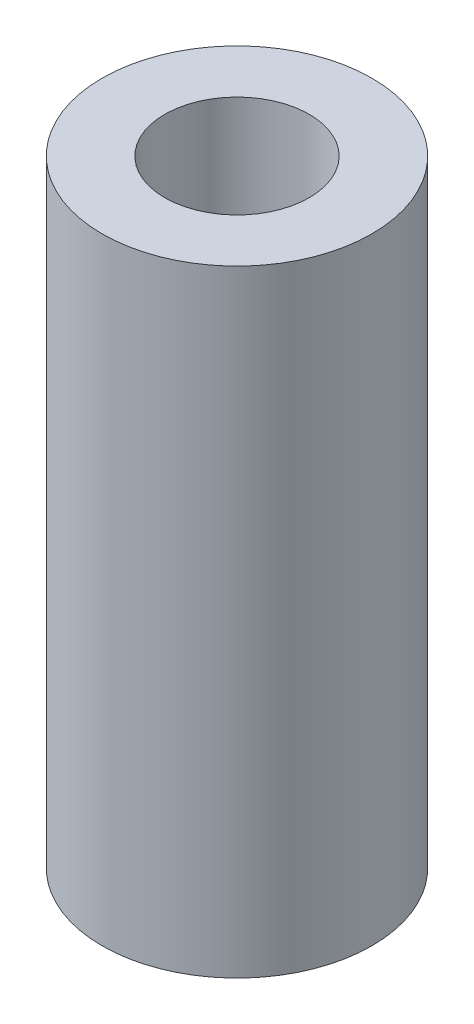
ISO-10303-21;
HEADER;
FILE_DESCRIPTION(('STEP AP214'),'2;1');
FILE_NAME('part.step','',(''),(''),'','','');
FILE_SCHEMA(('AUTOMOTIVE_DESIGN { 1 0 10303 214 1 1 1 1 }'));
ENDSEC;
DATA;
#1=APPLICATION_CONTEXT('core data for automotive mechanical design processes');
#2=APPLICATION_PROTOCOL_DEFINITION('international standard','automotive_design',2000,#1);
#3=PRODUCT_CONTEXT('',#1,'mechanical');
#4=PRODUCT('Part','Part','',(#3));
#5=PRODUCT_RELATED_PRODUCT_CATEGORY('part','',(#4));
#6=PRODUCT_DEFINITION_FORMATION('','',#4);
#7=PRODUCT_DEFINITION_CONTEXT('part definition',#1,'design');
#8=PRODUCT_DEFINITION('design','',#6,#7);
#9=PRODUCT_DEFINITION_SHAPE('','',#8);
#10=(LENGTH_UNIT() NAMED_UNIT(*) SI_UNIT(.MILLI.,.METRE.));
#11=(NAMED_UNIT(*) PLANE_ANGLE_UNIT() SI_UNIT($,.RADIAN.));
#12=(NAMED_UNIT(*) SI_UNIT($,.STERADIAN.) SOLID_ANGLE_UNIT());
#13=UNCERTAINTY_MEASURE_WITH_UNIT(LENGTH_MEASURE(1.E-05),#10,'distance_accuracy_value','');
#14=(GEOMETRIC_REPRESENTATION_CONTEXT(3) GLOBAL_UNCERTAINTY_ASSIGNED_CONTEXT((#13)) GLOBAL_UNIT_ASSIGNED_CONTEXT((#10,
#11,#12)) REPRESENTATION_CONTEXT('',''));
#15=CARTESIAN_POINT('',(0.,0.,0.));
#16=DIRECTION('',(0.,0.,1.));
#17=DIRECTION('',(1.,0.,0.));
#18=AXIS2_PLACEMENT_3D('',#15,#16,#17);
#19=CARTESIAN_POINT('',(0.,16.,0.));
#20=DIRECTION('',(0.,1.,0.));
#21=DIRECTION('',(0.,0.,1.));
#22=AXIS2_PLACEMENT_3D('',#19,#20,#21);
#23=PLANE('',#22);
#24=CARTESIAN_POINT('',(0.,16.,0.));
#25=DIRECTION('',(0.,1.,0.));
#26=DIRECTION('',(0.,0.,1.));
#27=AXIS2_PLACEMENT_3D('',#24,#25,#26);
#28=CIRCLE('',#27,3.5);
#29=CARTESIAN_POINT('',(0.,16.,3.5));
#30=VERTEX_POINT('',#29);
#31=EDGE_CURVE('E10',#30,#30,#28,.T.);
#32=ORIENTED_EDGE('',*,*,#31,.T.);
#33=EDGE_LOOP('',(#32));
#34=FACE_BOUND('',#33,.T.);
#35=CARTESIAN_POINT('',(0.,16.,0.));
#36=DIRECTION('',(0.,1.,0.));
#37=DIRECTION('',(0.,0.,1.));
#38=AXIS2_PLACEMENT_3D('',#35,#36,#37);
#39=CIRCLE('',#38,1.875);
#40=CARTESIAN_POINT('',(0.,16.,1.875));
#41=VERTEX_POINT('',#40);
#42=EDGE_CURVE('E44',#41,#41,#39,.T.);
#43=ORIENTED_EDGE('',*,*,#42,.F.);
#44=EDGE_LOOP('',(#43));
#45=FACE_BOUND('',#44,.T.);
#46=ADVANCED_FACE('F33',(#34,#45),#23,.T.);
#47=CARTESIAN_POINT('',(0.,0.,0.));
#48=DIRECTION('',(0.,1.,0.));
#49=DIRECTION('',(0.,0.,1.));
#50=AXIS2_PLACEMENT_3D('',#47,#48,#49);
#51=PLANE('',#50);
#52=CARTESIAN_POINT('',(0.,0.,0.));
#53=DIRECTION('',(0.,1.,0.));
#54=DIRECTION('',(0.,0.,1.));
#55=AXIS2_PLACEMENT_3D('',#52,#53,#54);
#56=CIRCLE('',#55,3.5);
#57=CARTESIAN_POINT('',(0.,0.,3.5));
#58=VERTEX_POINT('',#57);
#59=EDGE_CURVE('E37',#58,#58,#56,.T.);
#60=ORIENTED_EDGE('',*,*,#59,.F.);
#61=EDGE_LOOP('',(#60));
#62=FACE_BOUND('',#61,.T.);
#63=CARTESIAN_POINT('',(0.,0.,0.));
#64=DIRECTION('',(0.,1.,0.));
#65=DIRECTION('',(0.,0.,1.));
#66=AXIS2_PLACEMENT_3D('',#63,#64,#65);
#67=CIRCLE('',#66,1.875);
#68=CARTESIAN_POINT('',(0.,0.,1.875));
#69=VERTEX_POINT('',#68);
#70=EDGE_CURVE('E46',#69,#69,#67,.T.);
#71=ORIENTED_EDGE('',*,*,#70,.T.);
#72=EDGE_LOOP('',(#71));
#73=FACE_BOUND('',#72,.T.);
#74=ADVANCED_FACE('F56',(#62,#73),#51,.F.);
#75=CARTESIAN_POINT('',(0.,16.,0.));
#76=DIRECTION('',(0.,-1.,0.));
#77=DIRECTION('',(0.,0.,-1.));
#78=AXIS2_PLACEMENT_3D('',#75,#76,#77);
#79=CYLINDRICAL_SURFACE('',#78,3.5);
#80=ORIENTED_EDGE('',*,*,#31,.F.);
#81=EDGE_LOOP('',(#80));
#82=FACE_BOUND('',#81,.T.);
#83=ORIENTED_EDGE('',*,*,#59,.T.);
#84=EDGE_LOOP('',(#83));
#85=FACE_BOUND('',#84,.T.);
#86=ADVANCED_FACE('F35',(#82,#85),#79,.T.);
#87=CARTESIAN_POINT('',(0.,16.,0.));
#88=DIRECTION('',(0.,-1.,0.));
#89=DIRECTION('',(0.,0.,-1.));
#90=AXIS2_PLACEMENT_3D('',#87,#88,#89);
#91=CYLINDRICAL_SURFACE('',#90,1.875);
#92=ORIENTED_EDGE('',*,*,#42,.T.);
#93=EDGE_LOOP('',(#92));
#94=FACE_BOUND('',#93,.T.);
#95=ORIENTED_EDGE('',*,*,#70,.F.);
#96=EDGE_LOOP('',(#95));
#97=FACE_BOUND('',#96,.T.);
#98=ADVANCED_FACE('F52',(#94,#97),#91,.F.);
#99=CLOSED_SHELL('',(#46,#74,#86,#98));
#100=MANIFOLD_SOLID_BREP('B2',#99);
#101=ADVANCED_BREP_SHAPE_REPRESENTATION('',(#18,#100),#14);
#102=SHAPE_DEFINITION_REPRESENTATION(#9,#101);
ENDSEC;
END-ISO-10303-21;
